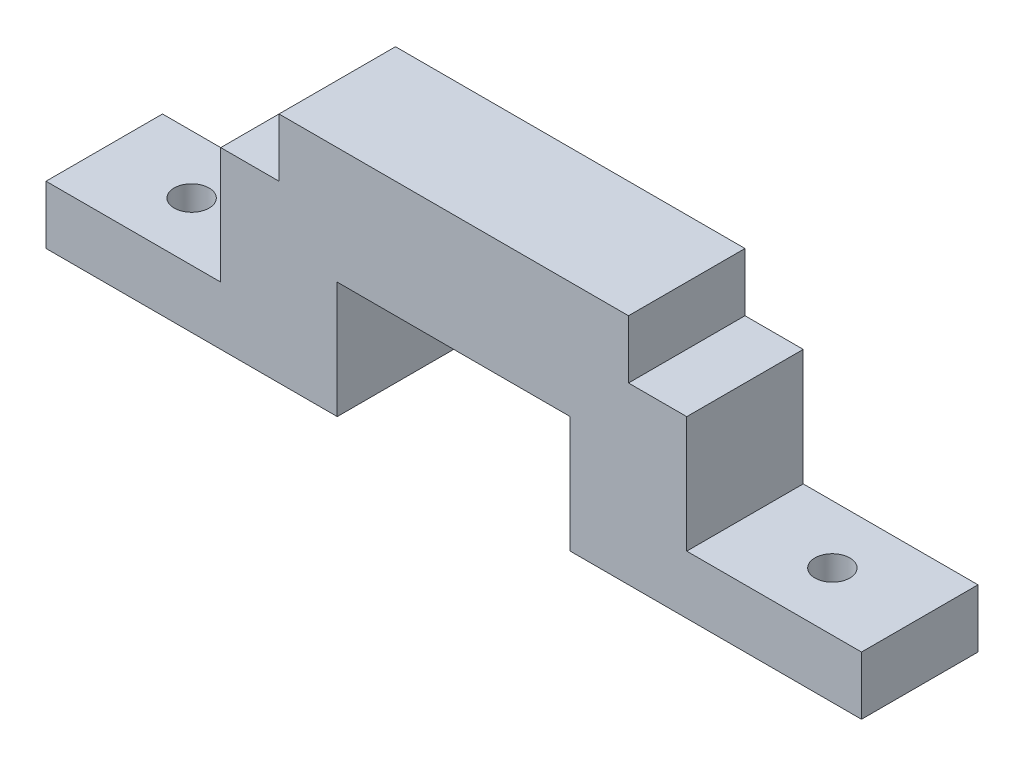
ISO-10303-21;
HEADER;
FILE_DESCRIPTION(('STEP AP214'),'2;1');
FILE_NAME('part.step','',(''),(''),'','','');
FILE_SCHEMA(('AUTOMOTIVE_DESIGN { 1 0 10303 214 1 1 1 1 }'));
ENDSEC;
DATA;
#1=APPLICATION_CONTEXT('core data for automotive mechanical design processes');
#2=APPLICATION_PROTOCOL_DEFINITION('international standard','automotive_design',2000,#1);
#3=PRODUCT_CONTEXT('',#1,'mechanical');
#4=PRODUCT('Part','Part','',(#3));
#5=PRODUCT_RELATED_PRODUCT_CATEGORY('part','',(#4));
#6=PRODUCT_DEFINITION_FORMATION('','',#4);
#7=PRODUCT_DEFINITION_CONTEXT('part definition',#1,'design');
#8=PRODUCT_DEFINITION('design','',#6,#7);
#9=PRODUCT_DEFINITION_SHAPE('','',#8);
#10=(LENGTH_UNIT() NAMED_UNIT(*) SI_UNIT(.MILLI.,.METRE.));
#11=(NAMED_UNIT(*) PLANE_ANGLE_UNIT() SI_UNIT($,.RADIAN.));
#12=(NAMED_UNIT(*) SI_UNIT($,.STERADIAN.) SOLID_ANGLE_UNIT());
#13=UNCERTAINTY_MEASURE_WITH_UNIT(LENGTH_MEASURE(1.E-05),#10,'distance_accuracy_value','');
#14=(GEOMETRIC_REPRESENTATION_CONTEXT(3) GLOBAL_UNCERTAINTY_ASSIGNED_CONTEXT((#13)) GLOBAL_UNIT_ASSIGNED_CONTEXT((#10,
#11,#12)) REPRESENTATION_CONTEXT('',''));
#15=CARTESIAN_POINT('',(0.,0.,0.));
#16=DIRECTION('',(0.,0.,1.));
#17=DIRECTION('',(1.,0.,0.));
#18=AXIS2_PLACEMENT_3D('',#15,#16,#17);
#19=CARTESIAN_POINT('',(-20.,0.,10.));
#20=DIRECTION('',(0.,1.,0.));
#21=DIRECTION('',(0.,0.,1.));
#22=AXIS2_PLACEMENT_3D('',#19,#20,#21);
#23=PLANE('',#22);
#24=CARTESIAN_POINT('',(-27.5,0.,5.));
#25=DIRECTION('',(0.,1.,0.));
#26=DIRECTION('',(-1.,0.,0.));
#27=AXIS2_PLACEMENT_3D('',#24,#25,#26);
#28=CIRCLE('',#27,1.5);
#29=CARTESIAN_POINT('',(-29.,0.,5.));
#30=VERTEX_POINT('',#29);
#31=EDGE_CURVE('E250',#30,#30,#28,.T.);
#32=ORIENTED_EDGE('',*,*,#31,.T.);
#33=EDGE_LOOP('',(#32));
#34=FACE_BOUND('',#33,.T.);
#35=DIRECTION('',(1.,0.,0.));
#36=VECTOR('',#35,1.);
#37=CARTESIAN_POINT('',(-20.,0.,0.));
#38=LINE('',#37,#36);
#39=CARTESIAN_POINT('',(-35.,0.,0.));
#40=VERTEX_POINT('',#39);
#41=CARTESIAN_POINT('',(-10.,0.,0.));
#42=VERTEX_POINT('',#41);
#43=EDGE_CURVE('E115',#40,#42,#38,.T.);
#44=ORIENTED_EDGE('',*,*,#43,.T.);
#45=DIRECTION('',(0.,0.,-1.));
#46=VECTOR('',#45,1.);
#47=CARTESIAN_POINT('',(-10.,0.,10.));
#48=LINE('',#47,#46);
#49=CARTESIAN_POINT('',(-10.,0.,10.));
#50=VERTEX_POINT('',#49);
#51=EDGE_CURVE('E11',#50,#42,#48,.T.);
#52=ORIENTED_EDGE('',*,*,#51,.F.);
#53=DIRECTION('',(1.,0.,0.));
#54=VECTOR('',#53,1.);
#55=CARTESIAN_POINT('',(-35.,0.,10.));
#56=LINE('',#55,#54);
#57=CARTESIAN_POINT('',(-35.,0.,10.));
#58=VERTEX_POINT('',#57);
#59=EDGE_CURVE('E121',#58,#50,#56,.T.);
#60=ORIENTED_EDGE('',*,*,#59,.F.);
#61=DIRECTION('',(0.,0.,-1.));
#62=VECTOR('',#61,1.);
#63=CARTESIAN_POINT('',(-35.,0.,10.));
#64=LINE('',#63,#62);
#65=EDGE_CURVE('E179',#58,#40,#64,.T.);
#66=ORIENTED_EDGE('',*,*,#65,.T.);
#67=EDGE_LOOP('',(#44,#52,#60,#66));
#68=FACE_BOUND('',#67,.T.);
#69=ADVANCED_FACE('F37',(#34,#68),#23,.F.);
#70=CARTESIAN_POINT('',(-10.,0.,10.));
#71=DIRECTION('',(-1.,0.,0.));
#72=DIRECTION('',(0.,0.,1.));
#73=AXIS2_PLACEMENT_3D('',#70,#71,#72);
#74=PLANE('',#73);
#75=DIRECTION('',(0.,1.,0.));
#76=VECTOR('',#75,1.);
#77=CARTESIAN_POINT('',(-10.,0.,0.));
#78=LINE('',#77,#76);
#79=CARTESIAN_POINT('',(-10.,10.,0.));
#80=VERTEX_POINT('',#79);
#81=EDGE_CURVE('E184',#42,#80,#78,.T.);
#82=ORIENTED_EDGE('',*,*,#81,.T.);
#83=DIRECTION('',(0.,0.,-1.));
#84=VECTOR('',#83,1.);
#85=CARTESIAN_POINT('',(-10.,10.,10.));
#86=LINE('',#85,#84);
#87=CARTESIAN_POINT('',(-10.,10.,10.));
#88=VERTEX_POINT('',#87);
#89=EDGE_CURVE('E46',#88,#80,#86,.T.);
#90=ORIENTED_EDGE('',*,*,#89,.F.);
#91=DIRECTION('',(0.,1.,0.));
#92=VECTOR('',#91,1.);
#93=CARTESIAN_POINT('',(-10.,0.,10.));
#94=LINE('',#93,#92);
#95=EDGE_CURVE('E263',#50,#88,#94,.T.);
#96=ORIENTED_EDGE('',*,*,#95,.F.);
#97=ORIENTED_EDGE('',*,*,#51,.T.);
#98=EDGE_LOOP('',(#82,#90,#96,#97));
#99=FACE_BOUND('',#98,.T.);
#100=ADVANCED_FACE('F301',(#99),#74,.F.);
#101=CARTESIAN_POINT('',(-10.,10.,10.));
#102=DIRECTION('',(0.,1.,0.));
#103=DIRECTION('',(0.,0.,1.));
#104=AXIS2_PLACEMENT_3D('',#101,#102,#103);
#105=PLANE('',#104);
#106=DIRECTION('',(1.,0.,0.));
#107=VECTOR('',#106,1.);
#108=CARTESIAN_POINT('',(-10.,10.,0.));
#109=LINE('',#108,#107);
#110=CARTESIAN_POINT('',(10.,10.,0.));
#111=VERTEX_POINT('',#110);
#112=EDGE_CURVE('E186',#80,#111,#109,.T.);
#113=ORIENTED_EDGE('',*,*,#112,.T.);
#114=DIRECTION('',(0.,0.,-1.));
#115=VECTOR('',#114,1.);
#116=CARTESIAN_POINT('',(10.,10.,10.));
#117=LINE('',#116,#115);
#118=CARTESIAN_POINT('',(10.,10.,10.));
#119=VERTEX_POINT('',#118);
#120=EDGE_CURVE('E244',#119,#111,#117,.T.);
#121=ORIENTED_EDGE('',*,*,#120,.F.);
#122=DIRECTION('',(1.,0.,0.));
#123=VECTOR('',#122,1.);
#124=CARTESIAN_POINT('',(-10.,10.,10.));
#125=LINE('',#124,#123);
#126=EDGE_CURVE('E265',#88,#119,#125,.T.);
#127=ORIENTED_EDGE('',*,*,#126,.F.);
#128=ORIENTED_EDGE('',*,*,#89,.T.);
#129=EDGE_LOOP('',(#113,#121,#127,#128));
#130=FACE_BOUND('',#129,.T.);
#131=ADVANCED_FACE('F307',(#130),#105,.F.);
#132=CARTESIAN_POINT('',(10.,10.,10.));
#133=DIRECTION('',(1.,0.,0.));
#134=DIRECTION('',(0.,0.,-1.));
#135=AXIS2_PLACEMENT_3D('',#132,#133,#134);
#136=PLANE('',#135);
#137=DIRECTION('',(0.,-1.,0.));
#138=VECTOR('',#137,1.);
#139=CARTESIAN_POINT('',(10.,10.,0.));
#140=LINE('',#139,#138);
#141=CARTESIAN_POINT('',(10.,0.,0.));
#142=VERTEX_POINT('',#141);
#143=EDGE_CURVE('E188',#111,#142,#140,.T.);
#144=ORIENTED_EDGE('',*,*,#143,.T.);
#145=DIRECTION('',(0.,0.,-1.));
#146=VECTOR('',#145,1.);
#147=CARTESIAN_POINT('',(10.,0.,10.));
#148=LINE('',#147,#146);
#149=CARTESIAN_POINT('',(10.,0.,10.));
#150=VERTEX_POINT('',#149);
#151=EDGE_CURVE('E241',#150,#142,#148,.T.);
#152=ORIENTED_EDGE('',*,*,#151,.F.);
#153=DIRECTION('',(0.,-1.,0.));
#154=VECTOR('',#153,1.);
#155=CARTESIAN_POINT('',(10.,10.,10.));
#156=LINE('',#155,#154);
#157=EDGE_CURVE('E267',#119,#150,#156,.T.);
#158=ORIENTED_EDGE('',*,*,#157,.F.);
#159=ORIENTED_EDGE('',*,*,#120,.T.);
#160=EDGE_LOOP('',(#144,#152,#158,#159));
#161=FACE_BOUND('',#160,.T.);
#162=ADVANCED_FACE('F311',(#161),#136,.F.);
#163=CARTESIAN_POINT('',(35.,0.,10.));
#164=DIRECTION('',(0.,1.,0.));
#165=DIRECTION('',(-1.,0.,0.));
#166=AXIS2_PLACEMENT_3D('',#163,#164,#165);
#167=PLANE('',#166);
#168=CARTESIAN_POINT('',(27.5,0.,5.));
#169=DIRECTION('',(0.,1.,0.));
#170=DIRECTION('',(-1.,0.,0.));
#171=AXIS2_PLACEMENT_3D('',#168,#169,#170);
#172=CIRCLE('',#171,1.5);
#173=CARTESIAN_POINT('',(26.,0.,5.));
#174=VERTEX_POINT('',#173);
#175=EDGE_CURVE('E255',#174,#174,#172,.T.);
#176=ORIENTED_EDGE('',*,*,#175,.T.);
#177=EDGE_LOOP('',(#176));
#178=FACE_BOUND('',#177,.T.);
#179=DIRECTION('',(1.,0.,0.));
#180=VECTOR('',#179,1.);
#181=CARTESIAN_POINT('',(35.,0.,0.));
#182=LINE('',#181,#180);
#183=CARTESIAN_POINT('',(35.,0.,0.));
#184=VERTEX_POINT('',#183);
#185=EDGE_CURVE('E191',#142,#184,#182,.T.);
#186=ORIENTED_EDGE('',*,*,#185,.T.);
#187=DIRECTION('',(0.,0.,-1.));
#188=VECTOR('',#187,1.);
#189=CARTESIAN_POINT('',(35.,0.,10.));
#190=LINE('',#189,#188);
#191=CARTESIAN_POINT('',(35.,0.,10.));
#192=VERTEX_POINT('',#191);
#193=EDGE_CURVE('E238',#192,#184,#190,.T.);
#194=ORIENTED_EDGE('',*,*,#193,.F.);
#195=DIRECTION('',(1.,0.,0.));
#196=VECTOR('',#195,1.);
#197=CARTESIAN_POINT('',(10.,0.,10.));
#198=LINE('',#197,#196);
#199=EDGE_CURVE('E269',#150,#192,#198,.T.);
#200=ORIENTED_EDGE('',*,*,#199,.F.);
#201=ORIENTED_EDGE('',*,*,#151,.T.);
#202=EDGE_LOOP('',(#186,#194,#200,#201));
#203=FACE_BOUND('',#202,.T.);
#204=ADVANCED_FACE('F315',(#178,#203),#167,.F.);
#205=CARTESIAN_POINT('',(35.,5.00000000000001,10.));
#206=DIRECTION('',(-1.,0.,0.));
#207=DIRECTION('',(0.,-1.,0.));
#208=AXIS2_PLACEMENT_3D('',#205,#206,#207);
#209=PLANE('',#208);
#210=DIRECTION('',(0.,1.,0.));
#211=VECTOR('',#210,1.);
#212=CARTESIAN_POINT('',(35.,5.00000000000001,0.));
#213=LINE('',#212,#211);
#214=CARTESIAN_POINT('',(35.,5.00000000000001,0.));
#215=VERTEX_POINT('',#214);
#216=EDGE_CURVE('E193',#184,#215,#213,.T.);
#217=ORIENTED_EDGE('',*,*,#216,.T.);
#218=DIRECTION('',(0.,0.,-1.));
#219=VECTOR('',#218,1.);
#220=CARTESIAN_POINT('',(35.,5.00000000000001,10.));
#221=LINE('',#220,#219);
#222=CARTESIAN_POINT('',(35.,5.00000000000001,10.));
#223=VERTEX_POINT('',#222);
#224=EDGE_CURVE('E235',#223,#215,#221,.T.);
#225=ORIENTED_EDGE('',*,*,#224,.F.);
#226=DIRECTION('',(0.,1.,0.));
#227=VECTOR('',#226,1.);
#228=CARTESIAN_POINT('',(35.,5.00000000000001,10.));
#229=LINE('',#228,#227);
#230=EDGE_CURVE('E271',#192,#223,#229,.T.);
#231=ORIENTED_EDGE('',*,*,#230,.F.);
#232=ORIENTED_EDGE('',*,*,#193,.T.);
#233=EDGE_LOOP('',(#217,#225,#231,#232));
#234=FACE_BOUND('',#233,.T.);
#235=ADVANCED_FACE('F321',(#234),#209,.F.);
#236=CARTESIAN_POINT('',(20.,5.00000000000001,10.));
#237=DIRECTION('',(0.,-1.,0.));
#238=DIRECTION('',(1.,0.,0.));
#239=AXIS2_PLACEMENT_3D('',#236,#237,#238);
#240=PLANE('',#239);
#241=CARTESIAN_POINT('',(27.5,5.00000000000001,5.));
#242=DIRECTION('',(0.,-1.,0.));
#243=DIRECTION('',(1.,0.,0.));
#244=AXIS2_PLACEMENT_3D('',#241,#242,#243);
#245=CIRCLE('',#244,1.5);
#246=CARTESIAN_POINT('',(29.,5.00000000000001,5.));
#247=VERTEX_POINT('',#246);
#248=EDGE_CURVE('E40',#247,#247,#245,.T.);
#249=ORIENTED_EDGE('',*,*,#248,.T.);
#250=EDGE_LOOP('',(#249));
#251=FACE_BOUND('',#250,.T.);
#252=DIRECTION('',(-1.,0.,0.));
#253=VECTOR('',#252,1.);
#254=CARTESIAN_POINT('',(20.,5.00000000000001,0.));
#255=LINE('',#254,#253);
#256=CARTESIAN_POINT('',(20.,5.00000000000001,0.));
#257=VERTEX_POINT('',#256);
#258=EDGE_CURVE('E195',#215,#257,#255,.T.);
#259=ORIENTED_EDGE('',*,*,#258,.T.);
#260=DIRECTION('',(0.,0.,-1.));
#261=VECTOR('',#260,1.);
#262=CARTESIAN_POINT('',(20.,5.00000000000001,10.));
#263=LINE('',#262,#261);
#264=CARTESIAN_POINT('',(20.,5.00000000000001,10.));
#265=VERTEX_POINT('',#264);
#266=EDGE_CURVE('E232',#265,#257,#263,.T.);
#267=ORIENTED_EDGE('',*,*,#266,.F.);
#268=DIRECTION('',(-1.,0.,0.));
#269=VECTOR('',#268,1.);
#270=CARTESIAN_POINT('',(20.,5.00000000000001,10.));
#271=LINE('',#270,#269);
#272=EDGE_CURVE('E273',#223,#265,#271,.T.);
#273=ORIENTED_EDGE('',*,*,#272,.F.);
#274=ORIENTED_EDGE('',*,*,#224,.T.);
#275=EDGE_LOOP('',(#259,#267,#273,#274));
#276=FACE_BOUND('',#275,.T.);
#277=ADVANCED_FACE('F325',(#251,#276),#240,.F.);
#278=CARTESIAN_POINT('',(20.,5.00000000000001,10.));
#279=DIRECTION('',(-1.,0.,0.));
#280=DIRECTION('',(0.,-1.,0.));
#281=AXIS2_PLACEMENT_3D('',#278,#279,#280);
#282=PLANE('',#281);
#283=DIRECTION('',(0.,1.,0.));
#284=VECTOR('',#283,1.);
#285=CARTESIAN_POINT('',(20.,5.00000000000001,0.));
#286=LINE('',#285,#284);
#287=CARTESIAN_POINT('',(20.,15.,0.));
#288=VERTEX_POINT('',#287);
#289=EDGE_CURVE('E197',#257,#288,#286,.T.);
#290=ORIENTED_EDGE('',*,*,#289,.T.);
#291=DIRECTION('',(0.,0.,-1.));
#292=VECTOR('',#291,1.);
#293=CARTESIAN_POINT('',(20.,15.,10.));
#294=LINE('',#293,#292);
#295=CARTESIAN_POINT('',(20.,15.,10.));
#296=VERTEX_POINT('',#295);
#297=EDGE_CURVE('E229',#296,#288,#294,.T.);
#298=ORIENTED_EDGE('',*,*,#297,.F.);
#299=DIRECTION('',(0.,1.,0.));
#300=VECTOR('',#299,1.);
#301=CARTESIAN_POINT('',(20.,5.00000000000001,10.));
#302=LINE('',#301,#300);
#303=EDGE_CURVE('E275',#265,#296,#302,.T.);
#304=ORIENTED_EDGE('',*,*,#303,.F.);
#305=ORIENTED_EDGE('',*,*,#266,.T.);
#306=EDGE_LOOP('',(#290,#298,#304,#305));
#307=FACE_BOUND('',#306,.T.);
#308=ADVANCED_FACE('F330',(#307),#282,.F.);
#309=CARTESIAN_POINT('',(15.,15.,10.));
#310=DIRECTION('',(0.,-1.,0.));
#311=DIRECTION('',(0.,0.,-1.));
#312=AXIS2_PLACEMENT_3D('',#309,#310,#311);
#313=PLANE('',#312);
#314=DIRECTION('',(-1.,0.,0.));
#315=VECTOR('',#314,1.);
#316=CARTESIAN_POINT('',(15.,15.,0.));
#317=LINE('',#316,#315);
#318=CARTESIAN_POINT('',(15.,15.,0.));
#319=VERTEX_POINT('',#318);
#320=EDGE_CURVE('E199',#288,#319,#317,.T.);
#321=ORIENTED_EDGE('',*,*,#320,.T.);
#322=DIRECTION('',(0.,0.,-1.));
#323=VECTOR('',#322,1.);
#324=CARTESIAN_POINT('',(15.,15.,10.));
#325=LINE('',#324,#323);
#326=CARTESIAN_POINT('',(15.,15.,10.));
#327=VERTEX_POINT('',#326);
#328=EDGE_CURVE('E226',#327,#319,#325,.T.);
#329=ORIENTED_EDGE('',*,*,#328,.F.);
#330=DIRECTION('',(-1.,0.,0.));
#331=VECTOR('',#330,1.);
#332=CARTESIAN_POINT('',(15.,15.,10.));
#333=LINE('',#332,#331);
#334=EDGE_CURVE('E277',#296,#327,#333,.T.);
#335=ORIENTED_EDGE('',*,*,#334,.F.);
#336=ORIENTED_EDGE('',*,*,#297,.T.);
#337=EDGE_LOOP('',(#321,#329,#335,#336));
#338=FACE_BOUND('',#337,.T.);
#339=ADVANCED_FACE('F336',(#338),#313,.F.);
#340=CARTESIAN_POINT('',(15.,20.,10.));
#341=DIRECTION('',(-1.,0.,0.));
#342=DIRECTION('',(0.,-1.,0.));
#343=AXIS2_PLACEMENT_3D('',#340,#341,#342);
#344=PLANE('',#343);
#345=DIRECTION('',(0.,1.,0.));
#346=VECTOR('',#345,1.);
#347=CARTESIAN_POINT('',(15.,20.,0.));
#348=LINE('',#347,#346);
#349=CARTESIAN_POINT('',(15.,20.,0.));
#350=VERTEX_POINT('',#349);
#351=EDGE_CURVE('E201',#319,#350,#348,.T.);
#352=ORIENTED_EDGE('',*,*,#351,.T.);
#353=DIRECTION('',(0.,0.,-1.));
#354=VECTOR('',#353,1.);
#355=CARTESIAN_POINT('',(15.,20.,10.));
#356=LINE('',#355,#354);
#357=CARTESIAN_POINT('',(15.,20.,10.));
#358=VERTEX_POINT('',#357);
#359=EDGE_CURVE('E223',#358,#350,#356,.T.);
#360=ORIENTED_EDGE('',*,*,#359,.F.);
#361=DIRECTION('',(0.,1.,0.));
#362=VECTOR('',#361,1.);
#363=CARTESIAN_POINT('',(15.,20.,10.));
#364=LINE('',#363,#362);
#365=EDGE_CURVE('E279',#327,#358,#364,.T.);
#366=ORIENTED_EDGE('',*,*,#365,.F.);
#367=ORIENTED_EDGE('',*,*,#328,.T.);
#368=EDGE_LOOP('',(#352,#360,#366,#367));
#369=FACE_BOUND('',#368,.T.);
#370=ADVANCED_FACE('F340',(#369),#344,.F.);
#371=CARTESIAN_POINT('',(15.,20.,10.));
#372=DIRECTION('',(0.,-1.,0.));
#373=DIRECTION('',(1.,0.,0.));
#374=AXIS2_PLACEMENT_3D('',#371,#372,#373);
#375=PLANE('',#374);
#376=DIRECTION('',(-1.,0.,0.));
#377=VECTOR('',#376,1.);
#378=CARTESIAN_POINT('',(15.,20.,0.));
#379=LINE('',#378,#377);
#380=CARTESIAN_POINT('',(-15.,20.,0.));
#381=VERTEX_POINT('',#380);
#382=EDGE_CURVE('E203',#350,#381,#379,.T.);
#383=ORIENTED_EDGE('',*,*,#382,.T.);
#384=DIRECTION('',(0.,0.,-1.));
#385=VECTOR('',#384,1.);
#386=CARTESIAN_POINT('',(-15.,20.,10.));
#387=LINE('',#386,#385);
#388=CARTESIAN_POINT('',(-15.,20.,10.));
#389=VERTEX_POINT('',#388);
#390=EDGE_CURVE('E220',#389,#381,#387,.T.);
#391=ORIENTED_EDGE('',*,*,#390,.F.);
#392=DIRECTION('',(-1.,0.,0.));
#393=VECTOR('',#392,1.);
#394=CARTESIAN_POINT('',(15.,20.,10.));
#395=LINE('',#394,#393);
#396=EDGE_CURVE('E281',#358,#389,#395,.T.);
#397=ORIENTED_EDGE('',*,*,#396,.F.);
#398=ORIENTED_EDGE('',*,*,#359,.T.);
#399=EDGE_LOOP('',(#383,#391,#397,#398));
#400=FACE_BOUND('',#399,.T.);
#401=ADVANCED_FACE('F343',(#400),#375,.F.);
#402=CARTESIAN_POINT('',(-15.,15.,10.));
#403=DIRECTION('',(1.,0.,0.));
#404=DIRECTION('',(0.,1.,0.));
#405=AXIS2_PLACEMENT_3D('',#402,#403,#404);
#406=PLANE('',#405);
#407=DIRECTION('',(0.,-1.,0.));
#408=VECTOR('',#407,1.);
#409=CARTESIAN_POINT('',(-15.,15.,0.));
#410=LINE('',#409,#408);
#411=CARTESIAN_POINT('',(-15.,15.,0.));
#412=VERTEX_POINT('',#411);
#413=EDGE_CURVE('E205',#381,#412,#410,.T.);
#414=ORIENTED_EDGE('',*,*,#413,.T.);
#415=DIRECTION('',(0.,0.,-1.));
#416=VECTOR('',#415,1.);
#417=CARTESIAN_POINT('',(-15.,15.,10.));
#418=LINE('',#417,#416);
#419=CARTESIAN_POINT('',(-15.,15.,10.));
#420=VERTEX_POINT('',#419);
#421=EDGE_CURVE('E217',#420,#412,#418,.T.);
#422=ORIENTED_EDGE('',*,*,#421,.F.);
#423=DIRECTION('',(0.,-1.,0.));
#424=VECTOR('',#423,1.);
#425=CARTESIAN_POINT('',(-15.,15.,10.));
#426=LINE('',#425,#424);
#427=EDGE_CURVE('E283',#389,#420,#426,.T.);
#428=ORIENTED_EDGE('',*,*,#427,.F.);
#429=ORIENTED_EDGE('',*,*,#390,.T.);
#430=EDGE_LOOP('',(#414,#422,#428,#429));
#431=FACE_BOUND('',#430,.T.);
#432=ADVANCED_FACE('F289',(#431),#406,.F.);
#433=CARTESIAN_POINT('',(-20.,15.,10.));
#434=DIRECTION('',(0.,-1.,0.));
#435=DIRECTION('',(0.,0.,-1.));
#436=AXIS2_PLACEMENT_3D('',#433,#434,#435);
#437=PLANE('',#436);
#438=DIRECTION('',(-1.,0.,0.));
#439=VECTOR('',#438,1.);
#440=CARTESIAN_POINT('',(-20.,15.,0.));
#441=LINE('',#440,#439);
#442=CARTESIAN_POINT('',(-20.,15.,0.));
#443=VERTEX_POINT('',#442);
#444=EDGE_CURVE('E207',#412,#443,#441,.T.);
#445=ORIENTED_EDGE('',*,*,#444,.T.);
#446=DIRECTION('',(0.,0.,-1.));
#447=VECTOR('',#446,1.);
#448=CARTESIAN_POINT('',(-20.,15.,10.));
#449=LINE('',#448,#447);
#450=CARTESIAN_POINT('',(-20.,15.,10.));
#451=VERTEX_POINT('',#450);
#452=EDGE_CURVE('E174',#451,#443,#449,.T.);
#453=ORIENTED_EDGE('',*,*,#452,.F.);
#454=DIRECTION('',(-1.,0.,0.));
#455=VECTOR('',#454,1.);
#456=CARTESIAN_POINT('',(-20.,15.,10.));
#457=LINE('',#456,#455);
#458=EDGE_CURVE('E165',#420,#451,#457,.T.);
#459=ORIENTED_EDGE('',*,*,#458,.F.);
#460=ORIENTED_EDGE('',*,*,#421,.T.);
#461=EDGE_LOOP('',(#445,#453,#459,#460));
#462=FACE_BOUND('',#461,.T.);
#463=ADVANCED_FACE('F293',(#462),#437,.F.);
#464=CARTESIAN_POINT('',(-20.,15.,10.));
#465=DIRECTION('',(1.,0.,0.));
#466=DIRECTION('',(0.,1.,0.));
#467=AXIS2_PLACEMENT_3D('',#464,#465,#466);
#468=PLANE('',#467);
#469=DIRECTION('',(0.,-1.,0.));
#470=VECTOR('',#469,1.);
#471=CARTESIAN_POINT('',(-20.,15.,0.));
#472=LINE('',#471,#470);
#473=CARTESIAN_POINT('',(-20.,5.,0.));
#474=VERTEX_POINT('',#473);
#475=EDGE_CURVE('E173',#443,#474,#472,.T.);
#476=ORIENTED_EDGE('',*,*,#475,.T.);
#477=DIRECTION('',(0.,0.,-1.));
#478=VECTOR('',#477,1.);
#479=CARTESIAN_POINT('',(-20.,5.,10.));
#480=LINE('',#479,#478);
#481=CARTESIAN_POINT('',(-20.,5.,10.));
#482=VERTEX_POINT('',#481);
#483=EDGE_CURVE('E170',#482,#474,#480,.T.);
#484=ORIENTED_EDGE('',*,*,#483,.F.);
#485=DIRECTION('',(0.,-1.,0.));
#486=VECTOR('',#485,1.);
#487=CARTESIAN_POINT('',(-20.,15.,10.));
#488=LINE('',#487,#486);
#489=EDGE_CURVE('E159',#451,#482,#488,.T.);
#490=ORIENTED_EDGE('',*,*,#489,.F.);
#491=ORIENTED_EDGE('',*,*,#452,.T.);
#492=EDGE_LOOP('',(#476,#484,#490,#491));
#493=FACE_BOUND('',#492,.T.);
#494=ADVANCED_FACE('F171',(#493),#468,.F.);
#495=CARTESIAN_POINT('',(-20.,5.,10.));
#496=DIRECTION('',(0.,-1.,0.));
#497=DIRECTION('',(1.,0.,0.));
#498=AXIS2_PLACEMENT_3D('',#495,#496,#497);
#499=PLANE('',#498);
#500=CARTESIAN_POINT('',(-27.5,5.,5.));
#501=DIRECTION('',(0.,-1.,0.));
#502=DIRECTION('',(1.,0.,0.));
#503=AXIS2_PLACEMENT_3D('',#500,#501,#502);
#504=CIRCLE('',#503,1.5);
#505=CARTESIAN_POINT('',(-26.,5.,5.));
#506=VERTEX_POINT('',#505);
#507=EDGE_CURVE('E248',#506,#506,#504,.T.);
#508=ORIENTED_EDGE('',*,*,#507,.T.);
#509=EDGE_LOOP('',(#508));
#510=FACE_BOUND('',#509,.T.);
#511=DIRECTION('',(-1.,0.,0.));
#512=VECTOR('',#511,1.);
#513=CARTESIAN_POINT('',(-20.,5.,0.));
#514=LINE('',#513,#512);
#515=CARTESIAN_POINT('',(-35.,5.,0.));
#516=VERTEX_POINT('',#515);
#517=EDGE_CURVE('E108',#474,#516,#514,.T.);
#518=ORIENTED_EDGE('',*,*,#517,.T.);
#519=DIRECTION('',(0.,0.,-1.));
#520=VECTOR('',#519,1.);
#521=CARTESIAN_POINT('',(-35.,5.,10.));
#522=LINE('',#521,#520);
#523=CARTESIAN_POINT('',(-35.,5.,10.));
#524=VERTEX_POINT('',#523);
#525=EDGE_CURVE('E175',#524,#516,#522,.T.);
#526=ORIENTED_EDGE('',*,*,#525,.F.);
#527=DIRECTION('',(-1.,0.,0.));
#528=VECTOR('',#527,1.);
#529=CARTESIAN_POINT('',(-20.,5.,10.));
#530=LINE('',#529,#528);
#531=EDGE_CURVE('E163',#482,#524,#530,.T.);
#532=ORIENTED_EDGE('',*,*,#531,.F.);
#533=ORIENTED_EDGE('',*,*,#483,.T.);
#534=EDGE_LOOP('',(#518,#526,#532,#533));
#535=FACE_BOUND('',#534,.T.);
#536=ADVANCED_FACE('F177',(#510,#535),#499,.F.);
#537=CARTESIAN_POINT('',(-35.,5.,10.));
#538=DIRECTION('',(1.,0.,0.));
#539=DIRECTION('',(0.,0.,-1.));
#540=AXIS2_PLACEMENT_3D('',#537,#538,#539);
#541=PLANE('',#540);
#542=DIRECTION('',(0.,-1.,0.));
#543=VECTOR('',#542,1.);
#544=CARTESIAN_POINT('',(-35.,5.,0.));
#545=LINE('',#544,#543);
#546=EDGE_CURVE('E211',#516,#40,#545,.T.);
#547=ORIENTED_EDGE('',*,*,#546,.T.);
#548=ORIENTED_EDGE('',*,*,#65,.F.);
#549=DIRECTION('',(0.,-1.,0.));
#550=VECTOR('',#549,1.);
#551=CARTESIAN_POINT('',(-35.,5.,10.));
#552=LINE('',#551,#550);
#553=EDGE_CURVE('E55',#524,#58,#552,.T.);
#554=ORIENTED_EDGE('',*,*,#553,.F.);
#555=ORIENTED_EDGE('',*,*,#525,.T.);
#556=EDGE_LOOP('',(#547,#548,#554,#555));
#557=FACE_BOUND('',#556,.T.);
#558=ADVANCED_FACE('F296',(#557),#541,.F.);
#559=CARTESIAN_POINT('',(0.,0.,10.));
#560=DIRECTION('',(0.,0.,1.));
#561=DIRECTION('',(1.,0.,0.));
#562=AXIS2_PLACEMENT_3D('',#559,#560,#561);
#563=PLANE('',#562);
#564=ORIENTED_EDGE('',*,*,#59,.T.);
#565=ORIENTED_EDGE('',*,*,#95,.T.);
#566=ORIENTED_EDGE('',*,*,#126,.T.);
#567=ORIENTED_EDGE('',*,*,#157,.T.);
#568=ORIENTED_EDGE('',*,*,#199,.T.);
#569=ORIENTED_EDGE('',*,*,#230,.T.);
#570=ORIENTED_EDGE('',*,*,#272,.T.);
#571=ORIENTED_EDGE('',*,*,#303,.T.);
#572=ORIENTED_EDGE('',*,*,#334,.T.);
#573=ORIENTED_EDGE('',*,*,#365,.T.);
#574=ORIENTED_EDGE('',*,*,#396,.T.);
#575=ORIENTED_EDGE('',*,*,#427,.T.);
#576=ORIENTED_EDGE('',*,*,#458,.T.);
#577=ORIENTED_EDGE('',*,*,#489,.T.);
#578=ORIENTED_EDGE('',*,*,#531,.T.);
#579=ORIENTED_EDGE('',*,*,#553,.T.);
#580=EDGE_LOOP('',(#564,#565,#566,#567,#568,#569,#570,#571,#572,#573,#574,#575,#576,#577,#578,#579));
#581=FACE_BOUND('',#580,.T.);
#582=ADVANCED_FACE('F161',(#581),#563,.T.);
#583=CARTESIAN_POINT('',(0.,0.,0.));
#584=DIRECTION('',(0.,0.,1.));
#585=DIRECTION('',(1.,0.,0.));
#586=AXIS2_PLACEMENT_3D('',#583,#584,#585);
#587=PLANE('',#586);
#588=ORIENTED_EDGE('',*,*,#43,.F.);
#589=ORIENTED_EDGE('',*,*,#546,.F.);
#590=ORIENTED_EDGE('',*,*,#517,.F.);
#591=ORIENTED_EDGE('',*,*,#475,.F.);
#592=ORIENTED_EDGE('',*,*,#444,.F.);
#593=ORIENTED_EDGE('',*,*,#413,.F.);
#594=ORIENTED_EDGE('',*,*,#382,.F.);
#595=ORIENTED_EDGE('',*,*,#351,.F.);
#596=ORIENTED_EDGE('',*,*,#320,.F.);
#597=ORIENTED_EDGE('',*,*,#289,.F.);
#598=ORIENTED_EDGE('',*,*,#258,.F.);
#599=ORIENTED_EDGE('',*,*,#216,.F.);
#600=ORIENTED_EDGE('',*,*,#185,.F.);
#601=ORIENTED_EDGE('',*,*,#143,.F.);
#602=ORIENTED_EDGE('',*,*,#112,.F.);
#603=ORIENTED_EDGE('',*,*,#81,.F.);
#604=EDGE_LOOP('',(#588,#589,#590,#591,#592,#593,#594,#595,#596,#597,#598,#599,#600,#601,#602,#603));
#605=FACE_BOUND('',#604,.T.);
#606=ADVANCED_FACE('F294',(#605),#587,.F.);
#607=CARTESIAN_POINT('',(-27.5,0.,5.));
#608=DIRECTION('',(0.,1.,0.));
#609=DIRECTION('',(-1.,0.,0.));
#610=AXIS2_PLACEMENT_3D('',#607,#608,#609);
#611=CYLINDRICAL_SURFACE('',#610,1.5);
#612=ORIENTED_EDGE('',*,*,#31,.F.);
#613=EDGE_LOOP('',(#612));
#614=FACE_BOUND('',#613,.T.);
#615=ORIENTED_EDGE('',*,*,#507,.F.);
#616=EDGE_LOOP('',(#615));
#617=FACE_BOUND('',#616,.T.);
#618=ADVANCED_FACE('F434',(#614,#617),#611,.F.);
#619=CARTESIAN_POINT('',(27.5,0.,5.));
#620=DIRECTION('',(0.,1.,0.));
#621=DIRECTION('',(-1.,0.,0.));
#622=AXIS2_PLACEMENT_3D('',#619,#620,#621);
#623=CYLINDRICAL_SURFACE('',#622,1.5);
#624=ORIENTED_EDGE('',*,*,#175,.F.);
#625=EDGE_LOOP('',(#624));
#626=FACE_BOUND('',#625,.T.);
#627=ORIENTED_EDGE('',*,*,#248,.F.);
#628=EDGE_LOOP('',(#627));
#629=FACE_BOUND('',#628,.T.);
#630=ADVANCED_FACE('F471',(#626,#629),#623,.F.);
#631=CLOSED_SHELL('',(#69,#100,#131,#162,#204,#235,#277,#308,#339,#370,#401,#432,#463,#494,#536,
#558,#582,#606,#618,#630));
#632=MANIFOLD_SOLID_BREP('B2',#631);
#633=ADVANCED_BREP_SHAPE_REPRESENTATION('',(#18,#632),#14);
#634=SHAPE_DEFINITION_REPRESENTATION(#9,#633);
ENDSEC;
END-ISO-10303-21;
